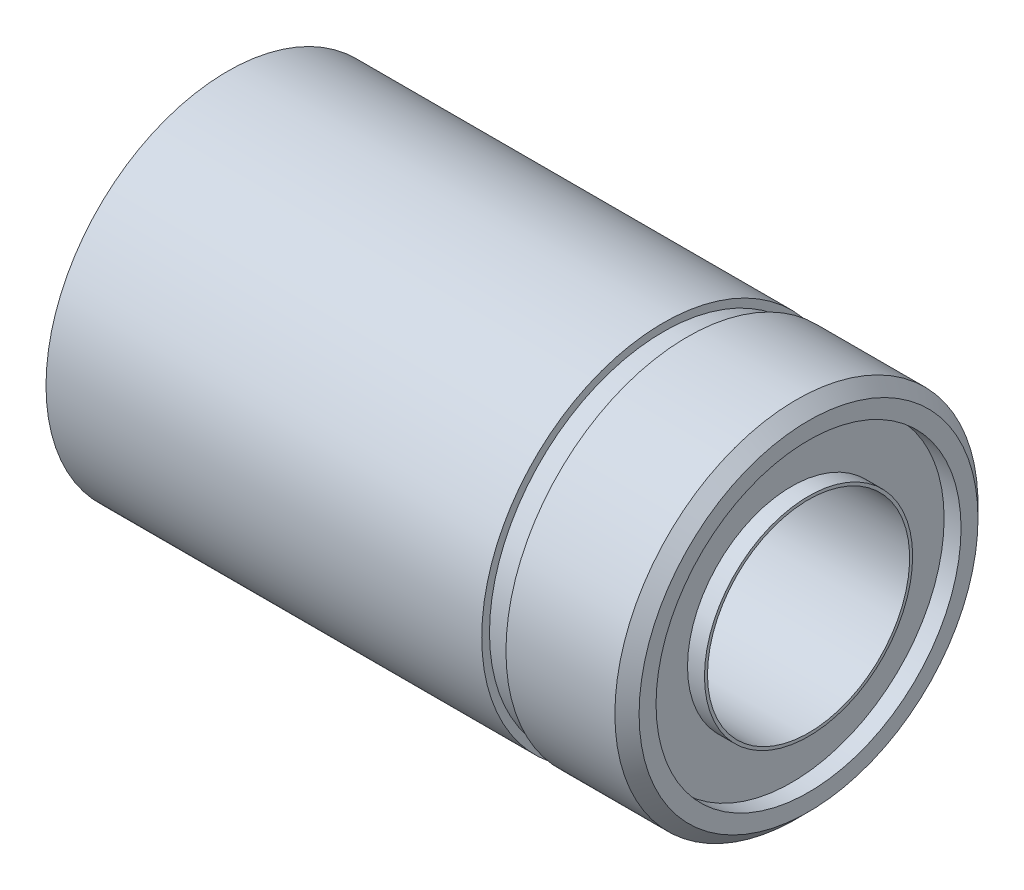
ISO-10303-21;
HEADER;
FILE_DESCRIPTION(('STEP AP214'),'2;1');
FILE_NAME('part.step','',(''),(''),'','','');
FILE_SCHEMA(('AUTOMOTIVE_DESIGN { 1 0 10303 214 1 1 1 1 }'));
ENDSEC;
DATA;
#1=APPLICATION_CONTEXT('core data for automotive mechanical design processes');
#2=APPLICATION_PROTOCOL_DEFINITION('international standard','automotive_design',2000,#1);
#3=PRODUCT_CONTEXT('',#1,'mechanical');
#4=PRODUCT('Part','Part','',(#3));
#5=PRODUCT_RELATED_PRODUCT_CATEGORY('part','',(#4));
#6=PRODUCT_DEFINITION_FORMATION('','',#4);
#7=PRODUCT_DEFINITION_CONTEXT('part definition',#1,'design');
#8=PRODUCT_DEFINITION('design','',#6,#7);
#9=PRODUCT_DEFINITION_SHAPE('','',#8);
#10=(LENGTH_UNIT() NAMED_UNIT(*) SI_UNIT(.MILLI.,.METRE.));
#11=(NAMED_UNIT(*) PLANE_ANGLE_UNIT() SI_UNIT($,.RADIAN.));
#12=(NAMED_UNIT(*) SI_UNIT($,.STERADIAN.) SOLID_ANGLE_UNIT());
#13=UNCERTAINTY_MEASURE_WITH_UNIT(LENGTH_MEASURE(1.E-05),#10,'distance_accuracy_value','');
#14=(GEOMETRIC_REPRESENTATION_CONTEXT(3) GLOBAL_UNCERTAINTY_ASSIGNED_CONTEXT((#13)) GLOBAL_UNIT_ASSIGNED_CONTEXT((#10,
#11,#12)) REPRESENTATION_CONTEXT('',''));
#15=CARTESIAN_POINT('',(0.,0.,0.));
#16=DIRECTION('',(0.,0.,1.));
#17=DIRECTION('',(1.,0.,0.));
#18=AXIS2_PLACEMENT_3D('',#15,#16,#17);
#19=CARTESIAN_POINT('',(0.,0.,0.));
#20=DIRECTION('',(-1.,0.,0.));
#21=DIRECTION('',(0.,0.,1.));
#22=AXIS2_PLACEMENT_3D('',#19,#20,#21);
#23=CYLINDRICAL_SURFACE('',#22,4.175);
#24=CARTESIAN_POINT('',(45.,0.,0.));
#25=DIRECTION('',(-1.,0.,0.));
#26=DIRECTION('',(0.,0.,1.));
#27=AXIS2_PLACEMENT_3D('',#24,#25,#26);
#28=CIRCLE('',#27,4.175);
#29=CARTESIAN_POINT('',(45.,0.,4.175));
#30=VERTEX_POINT('',#29);
#31=EDGE_CURVE('E47',#30,#30,#28,.T.);
#32=ORIENTED_EDGE('',*,*,#31,.F.);
#33=EDGE_LOOP('',(#32));
#34=FACE_BOUND('',#33,.T.);
#35=CARTESIAN_POINT('',(21.,0.,0.));
#36=DIRECTION('',(-1.,0.,0.));
#37=DIRECTION('',(0.,0.,1.));
#38=AXIS2_PLACEMENT_3D('',#35,#36,#37);
#39=CIRCLE('',#38,4.175);
#40=CARTESIAN_POINT('',(21.,0.,4.175));
#41=VERTEX_POINT('',#40);
#42=EDGE_CURVE('E76',#41,#41,#39,.F.);
#43=ORIENTED_EDGE('',*,*,#42,.F.);
#44=EDGE_LOOP('',(#43));
#45=FACE_BOUND('',#44,.T.);
#46=ADVANCED_FACE('F35',(#34,#45),#23,.F.);
#47=CARTESIAN_POINT('',(0.,0.,0.));
#48=DIRECTION('',(-1.,0.,0.));
#49=DIRECTION('',(0.,0.,1.));
#50=AXIS2_PLACEMENT_3D('',#47,#48,#49);
#51=CYLINDRICAL_SURFACE('',#50,7.5);
#52=CARTESIAN_POINT('',(39.,0.,0.));
#53=DIRECTION('',(-1.,0.,0.));
#54=DIRECTION('',(0.,0.,1.));
#55=AXIS2_PLACEMENT_3D('',#52,#53,#54);
#56=CIRCLE('',#55,7.5);
#57=CARTESIAN_POINT('',(39.,0.,7.5));
#58=VERTEX_POINT('',#57);
#59=EDGE_CURVE('E73',#58,#58,#56,.T.);
#60=ORIENTED_EDGE('',*,*,#59,.T.);
#61=EDGE_LOOP('',(#60));
#62=FACE_BOUND('',#61,.T.);
#63=CARTESIAN_POINT('',(21.,0.,0.));
#64=DIRECTION('',(-1.,0.,0.));
#65=DIRECTION('',(0.,0.,1.));
#66=AXIS2_PLACEMENT_3D('',#63,#64,#65);
#67=CIRCLE('',#66,7.5);
#68=CARTESIAN_POINT('',(21.,0.,7.5));
#69=VERTEX_POINT('',#68);
#70=EDGE_CURVE('E39',#69,#69,#67,.T.);
#71=ORIENTED_EDGE('',*,*,#70,.F.);
#72=EDGE_LOOP('',(#71));
#73=FACE_BOUND('',#72,.T.);
#74=ADVANCED_FACE('F85',(#62,#73),#51,.T.);
#75=CARTESIAN_POINT('',(45.,4.3,0.));
#76=DIRECTION('',(-1.,0.,0.));
#77=DIRECTION('',(0.,0.,1.));
#78=AXIS2_PLACEMENT_3D('',#75,#76,#77);
#79=PLANE('',#78);
#80=CARTESIAN_POINT('',(45.,0.,0.));
#81=DIRECTION('',(-1.,0.,0.));
#82=DIRECTION('',(0.,0.,1.));
#83=AXIS2_PLACEMENT_3D('',#80,#81,#82);
#84=CIRCLE('',#83,4.3);
#85=CARTESIAN_POINT('',(45.,0.,4.3));
#86=VERTEX_POINT('',#85);
#87=EDGE_CURVE('E52',#86,#86,#84,.T.);
#88=ORIENTED_EDGE('',*,*,#87,.F.);
#89=EDGE_LOOP('',(#88));
#90=FACE_BOUND('',#89,.T.);
#91=ORIENTED_EDGE('',*,*,#31,.T.);
#92=EDGE_LOOP('',(#91));
#93=FACE_BOUND('',#92,.T.);
#94=ADVANCED_FACE('F87',(#90,#93),#79,.F.);
#95=CARTESIAN_POINT('',(0.,0.,0.));
#96=DIRECTION('',(-1.,0.,0.));
#97=DIRECTION('',(0.,0.,1.));
#98=AXIS2_PLACEMENT_3D('',#95,#96,#97);
#99=CYLINDRICAL_SURFACE('',#98,4.3);
#100=CARTESIAN_POINT('',(44.3,0.,0.));
#101=DIRECTION('',(-1.,0.,0.));
#102=DIRECTION('',(0.,0.,1.));
#103=AXIS2_PLACEMENT_3D('',#100,#101,#102);
#104=CIRCLE('',#103,4.3);
#105=CARTESIAN_POINT('',(44.3,0.,4.3));
#106=VERTEX_POINT('',#105);
#107=EDGE_CURVE('E55',#106,#106,#104,.T.);
#108=ORIENTED_EDGE('',*,*,#107,.F.);
#109=EDGE_LOOP('',(#108));
#110=FACE_BOUND('',#109,.T.);
#111=ORIENTED_EDGE('',*,*,#87,.T.);
#112=EDGE_LOOP('',(#111));
#113=FACE_BOUND('',#112,.T.);
#114=ADVANCED_FACE('F94',(#110,#113),#99,.T.);
#115=CARTESIAN_POINT('',(44.3,6.3,0.));
#116=DIRECTION('',(-1.,0.,0.));
#117=DIRECTION('',(0.,0.,1.));
#118=AXIS2_PLACEMENT_3D('',#115,#116,#117);
#119=PLANE('',#118);
#120=CARTESIAN_POINT('',(44.3,0.,0.));
#121=DIRECTION('',(-1.,0.,0.));
#122=DIRECTION('',(0.,0.,1.));
#123=AXIS2_PLACEMENT_3D('',#120,#121,#122);
#124=CIRCLE('',#123,6.3);
#125=CARTESIAN_POINT('',(44.3,0.,6.3));
#126=VERTEX_POINT('',#125);
#127=EDGE_CURVE('E58',#126,#126,#124,.T.);
#128=ORIENTED_EDGE('',*,*,#127,.F.);
#129=EDGE_LOOP('',(#128));
#130=FACE_BOUND('',#129,.T.);
#131=ORIENTED_EDGE('',*,*,#107,.T.);
#132=EDGE_LOOP('',(#131));
#133=FACE_BOUND('',#132,.T.);
#134=ADVANCED_FACE('F122',(#130,#133),#119,.F.);
#135=CARTESIAN_POINT('',(0.,0.,0.));
#136=DIRECTION('',(-1.,0.,0.));
#137=DIRECTION('',(0.,0.,1.));
#138=AXIS2_PLACEMENT_3D('',#135,#136,#137);
#139=CYLINDRICAL_SURFACE('',#138,6.3);
#140=CARTESIAN_POINT('',(45.,0.,0.));
#141=DIRECTION('',(-1.,0.,0.));
#142=DIRECTION('',(0.,0.,1.));
#143=AXIS2_PLACEMENT_3D('',#140,#141,#142);
#144=CIRCLE('',#143,6.3);
#145=CARTESIAN_POINT('',(45.,0.,6.3));
#146=VERTEX_POINT('',#145);
#147=EDGE_CURVE('E61',#146,#146,#144,.T.);
#148=ORIENTED_EDGE('',*,*,#147,.F.);
#149=EDGE_LOOP('',(#148));
#150=FACE_BOUND('',#149,.T.);
#151=ORIENTED_EDGE('',*,*,#127,.T.);
#152=EDGE_LOOP('',(#151));
#153=FACE_BOUND('',#152,.T.);
#154=ADVANCED_FACE('F119',(#150,#153),#139,.F.);
#155=CARTESIAN_POINT('',(45.,7.5,0.));
#156=DIRECTION('',(-1.,0.,0.));
#157=DIRECTION('',(0.,0.,1.));
#158=AXIS2_PLACEMENT_3D('',#155,#156,#157);
#159=PLANE('',#158);
#160=CARTESIAN_POINT('',(45.,0.,0.));
#161=DIRECTION('',(-1.,0.,0.));
#162=DIRECTION('',(0.,0.,1.));
#163=AXIS2_PLACEMENT_3D('',#160,#161,#162);
#164=CIRCLE('',#163,7.00000000000001);
#165=CARTESIAN_POINT('',(45.,0.,7.00000000000001));
#166=VERTEX_POINT('',#165);
#167=EDGE_CURVE('E10',#166,#166,#164,.F.);
#168=ORIENTED_EDGE('',*,*,#167,.T.);
#169=EDGE_LOOP('',(#168));
#170=FACE_BOUND('',#169,.T.);
#171=ORIENTED_EDGE('',*,*,#147,.T.);
#172=EDGE_LOOP('',(#171));
#173=FACE_BOUND('',#172,.T.);
#174=ADVANCED_FACE('F115',(#170,#173),#159,.F.);
#175=CARTESIAN_POINT('',(0.,0.,0.));
#176=DIRECTION('',(-1.,0.,0.));
#177=DIRECTION('',(0.,0.,1.));
#178=AXIS2_PLACEMENT_3D('',#175,#176,#177);
#179=CYLINDRICAL_SURFACE('',#178,7.5);
#180=CARTESIAN_POINT('',(44.5,0.,0.));
#181=DIRECTION('',(-1.,0.,0.));
#182=DIRECTION('',(0.,0.,1.));
#183=AXIS2_PLACEMENT_3D('',#180,#181,#182);
#184=CIRCLE('',#183,7.5);
#185=CARTESIAN_POINT('',(44.5,0.,7.5));
#186=VERTEX_POINT('',#185);
#187=EDGE_CURVE('E43',#186,#186,#184,.T.);
#188=ORIENTED_EDGE('',*,*,#187,.T.);
#189=EDGE_LOOP('',(#188));
#190=FACE_BOUND('',#189,.T.);
#191=CARTESIAN_POINT('',(40.,0.,0.));
#192=DIRECTION('',(-1.,0.,0.));
#193=DIRECTION('',(0.,0.,1.));
#194=AXIS2_PLACEMENT_3D('',#191,#192,#193);
#195=CIRCLE('',#194,7.5);
#196=CARTESIAN_POINT('',(40.,0.,7.5));
#197=VERTEX_POINT('',#196);
#198=EDGE_CURVE('E64',#197,#197,#195,.T.);
#199=ORIENTED_EDGE('',*,*,#198,.F.);
#200=EDGE_LOOP('',(#199));
#201=FACE_BOUND('',#200,.T.);
#202=ADVANCED_FACE('F111',(#190,#201),#179,.T.);
#203=CARTESIAN_POINT('',(40.,7.5,0.));
#204=DIRECTION('',(1.,0.,0.));
#205=DIRECTION('',(0.,0.,-1.));
#206=AXIS2_PLACEMENT_3D('',#203,#204,#205);
#207=PLANE('',#206);
#208=CARTESIAN_POINT('',(40.,0.,0.));
#209=DIRECTION('',(-1.,0.,0.));
#210=DIRECTION('',(0.,0.,1.));
#211=AXIS2_PLACEMENT_3D('',#208,#209,#210);
#212=CIRCLE('',#211,7.18);
#213=CARTESIAN_POINT('',(40.,0.,7.18));
#214=VERTEX_POINT('',#213);
#215=EDGE_CURVE('E67',#214,#214,#212,.T.);
#216=ORIENTED_EDGE('',*,*,#215,.F.);
#217=EDGE_LOOP('',(#216));
#218=FACE_BOUND('',#217,.T.);
#219=ORIENTED_EDGE('',*,*,#198,.T.);
#220=EDGE_LOOP('',(#219));
#221=FACE_BOUND('',#220,.T.);
#222=ADVANCED_FACE('F107',(#218,#221),#207,.F.);
#223=CARTESIAN_POINT('',(0.,0.,0.));
#224=DIRECTION('',(-1.,0.,0.));
#225=DIRECTION('',(0.,0.,1.));
#226=AXIS2_PLACEMENT_3D('',#223,#224,#225);
#227=CYLINDRICAL_SURFACE('',#226,7.18);
#228=CARTESIAN_POINT('',(39.,0.,0.));
#229=DIRECTION('',(-1.,0.,0.));
#230=DIRECTION('',(0.,0.,1.));
#231=AXIS2_PLACEMENT_3D('',#228,#229,#230);
#232=CIRCLE('',#231,7.18);
#233=CARTESIAN_POINT('',(39.,0.,7.18));
#234=VERTEX_POINT('',#233);
#235=EDGE_CURVE('E70',#234,#234,#232,.T.);
#236=ORIENTED_EDGE('',*,*,#235,.F.);
#237=EDGE_LOOP('',(#236));
#238=FACE_BOUND('',#237,.T.);
#239=ORIENTED_EDGE('',*,*,#215,.T.);
#240=EDGE_LOOP('',(#239));
#241=FACE_BOUND('',#240,.T.);
#242=ADVANCED_FACE('F103',(#238,#241),#227,.T.);
#243=CARTESIAN_POINT('',(39.,7.5,0.));
#244=DIRECTION('',(-1.,0.,0.));
#245=DIRECTION('',(0.,0.,1.));
#246=AXIS2_PLACEMENT_3D('',#243,#244,#245);
#247=PLANE('',#246);
#248=ORIENTED_EDGE('',*,*,#59,.F.);
#249=EDGE_LOOP('',(#248));
#250=FACE_BOUND('',#249,.T.);
#251=ORIENTED_EDGE('',*,*,#235,.T.);
#252=EDGE_LOOP('',(#251));
#253=FACE_BOUND('',#252,.T.);
#254=ADVANCED_FACE('F100',(#250,#253),#247,.F.);
#255=CARTESIAN_POINT('',(44.5,0.,0.));
#256=DIRECTION('',(-1.,0.,0.));
#257=DIRECTION('',(0.,0.,1.));
#258=AXIS2_PLACEMENT_3D('',#255,#256,#257);
#259=CONICAL_SURFACE('',#258,7.5,0.785398163397446);
#260=ORIENTED_EDGE('',*,*,#167,.F.);
#261=EDGE_LOOP('',(#260));
#262=FACE_BOUND('',#261,.T.);
#263=ORIENTED_EDGE('',*,*,#187,.F.);
#264=EDGE_LOOP('',(#263));
#265=FACE_BOUND('',#264,.T.);
#266=ADVANCED_FACE('F37',(#262,#265),#259,.T.);
#267=CARTESIAN_POINT('',(21.,0.,0.));
#268=DIRECTION('',(-1.,0.,0.));
#269=DIRECTION('',(0.,0.,1.));
#270=AXIS2_PLACEMENT_3D('',#267,#268,#269);
#271=PLANE('',#270);
#272=ORIENTED_EDGE('',*,*,#70,.T.);
#273=EDGE_LOOP('',(#272));
#274=FACE_BOUND('',#273,.T.);
#275=ORIENTED_EDGE('',*,*,#42,.T.);
#276=EDGE_LOOP('',(#275));
#277=FACE_BOUND('',#276,.T.);
#278=ADVANCED_FACE('F83',(#274,#277),#271,.T.);
#279=CLOSED_SHELL('',(#46,#74,#94,#114,#134,#154,#174,#202,#222,#242,#254,#266,#278));
#280=MANIFOLD_SOLID_BREP('B2',#279);
#281=ADVANCED_BREP_SHAPE_REPRESENTATION('',(#18,#280),#14);
#282=SHAPE_DEFINITION_REPRESENTATION(#9,#281);
ENDSEC;
END-ISO-10303-21;
